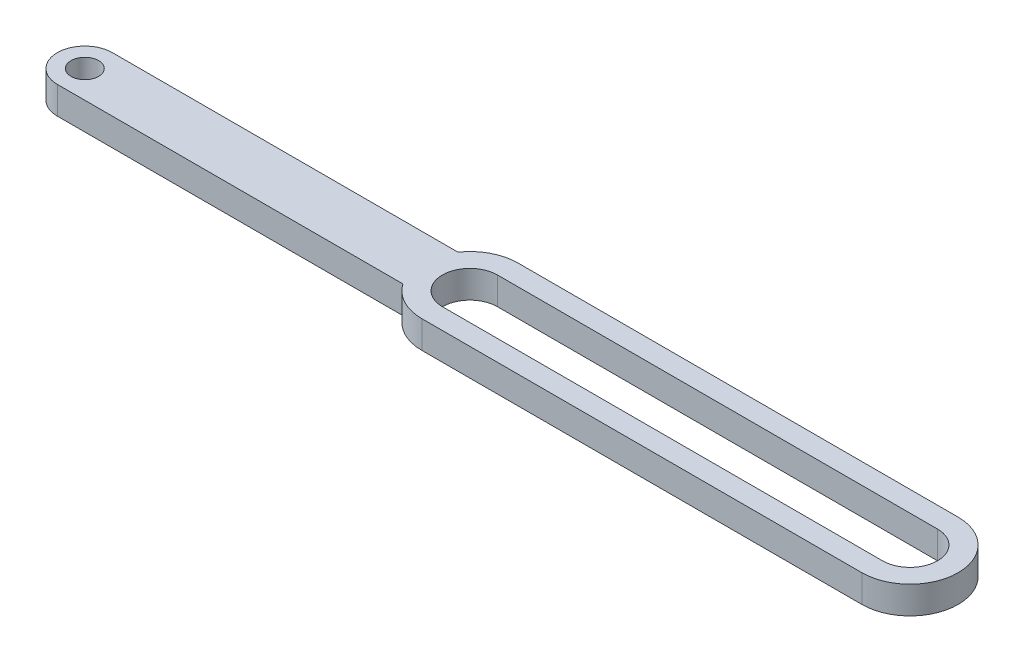
ISO-10303-21;
HEADER;
FILE_DESCRIPTION(('STEP AP214'),'2;1');
FILE_NAME('part.step','',(''),(''),'','','');
FILE_SCHEMA(('AUTOMOTIVE_DESIGN { 1 0 10303 214 1 1 1 1 }'));
ENDSEC;
DATA;
#1=APPLICATION_CONTEXT('core data for automotive mechanical design processes');
#2=APPLICATION_PROTOCOL_DEFINITION('international standard','automotive_design',2000,#1);
#3=PRODUCT_CONTEXT('',#1,'mechanical');
#4=PRODUCT('Part','Part','',(#3));
#5=PRODUCT_RELATED_PRODUCT_CATEGORY('part','',(#4));
#6=PRODUCT_DEFINITION_FORMATION('','',#4);
#7=PRODUCT_DEFINITION_CONTEXT('part definition',#1,'design');
#8=PRODUCT_DEFINITION('design','',#6,#7);
#9=PRODUCT_DEFINITION_SHAPE('','',#8);
#10=(LENGTH_UNIT() NAMED_UNIT(*) SI_UNIT(.MILLI.,.METRE.));
#11=(NAMED_UNIT(*) PLANE_ANGLE_UNIT() SI_UNIT($,.RADIAN.));
#12=(NAMED_UNIT(*) SI_UNIT($,.STERADIAN.) SOLID_ANGLE_UNIT());
#13=UNCERTAINTY_MEASURE_WITH_UNIT(LENGTH_MEASURE(1.E-05),#10,'distance_accuracy_value','');
#14=(GEOMETRIC_REPRESENTATION_CONTEXT(3) GLOBAL_UNCERTAINTY_ASSIGNED_CONTEXT((#13)) GLOBAL_UNIT_ASSIGNED_CONTEXT((#10,
#11,#12)) REPRESENTATION_CONTEXT('',''));
#15=CARTESIAN_POINT('',(0.,0.,0.));
#16=DIRECTION('',(0.,0.,1.));
#17=DIRECTION('',(1.,0.,0.));
#18=AXIS2_PLACEMENT_3D('',#15,#16,#17);
#19=CARTESIAN_POINT('',(-30.,2.,0.));
#20=DIRECTION('',(0.,1.,0.));
#21=DIRECTION('',(0.,0.,1.));
#22=AXIS2_PLACEMENT_3D('',#19,#20,#21);
#23=PLANE('',#22);
#24=CARTESIAN_POINT('',(-30.,2.,0.));
#25=DIRECTION('',(0.,1.,0.));
#26=DIRECTION('',(0.,0.,1.));
#27=AXIS2_PLACEMENT_3D('',#24,#25,#26);
#28=CIRCLE('',#27,2.);
#29=CARTESIAN_POINT('',(-30.,2.,-2.));
#30=VERTEX_POINT('',#29);
#31=CARTESIAN_POINT('',(-30.,2.,2.));
#32=VERTEX_POINT('',#31);
#33=EDGE_CURVE('E170',#30,#32,#28,.T.);
#34=ORIENTED_EDGE('',*,*,#33,.T.);
#35=DIRECTION('',(1.,0.,0.));
#36=VECTOR('',#35,1.);
#37=CARTESIAN_POINT('',(-30.,2.,2.));
#38=LINE('',#37,#36);
#39=CARTESIAN_POINT('',(-4.87228132326901,2.,2.));
#40=VERTEX_POINT('',#39);
#41=EDGE_CURVE('E173',#32,#40,#38,.T.);
#42=ORIENTED_EDGE('',*,*,#41,.T.);
#43=CARTESIAN_POINT('',(-2.,2.,0.));
#44=DIRECTION('',(0.,1.,0.));
#45=DIRECTION('',(0.,0.,1.));
#46=AXIS2_PLACEMENT_3D('',#43,#44,#45);
#47=CIRCLE('',#46,3.5);
#48=CARTESIAN_POINT('',(-2.,2.,3.5));
#49=VERTEX_POINT('',#48);
#50=EDGE_CURVE('E176',#40,#49,#47,.T.);
#51=ORIENTED_EDGE('',*,*,#50,.T.);
#52=DIRECTION('',(1.,0.,0.));
#53=VECTOR('',#52,1.);
#54=CARTESIAN_POINT('',(-2.,2.,3.5));
#55=LINE('',#54,#53);
#56=CARTESIAN_POINT('',(30.,2.,3.49999999999999));
#57=VERTEX_POINT('',#56);
#58=EDGE_CURVE('E178',#49,#57,#55,.T.);
#59=ORIENTED_EDGE('',*,*,#58,.T.);
#60=CARTESIAN_POINT('',(30.,2.,0.));
#61=DIRECTION('',(0.,1.,0.));
#62=DIRECTION('',(0.,0.,1.));
#63=AXIS2_PLACEMENT_3D('',#60,#61,#62);
#64=CIRCLE('',#63,3.5);
#65=CARTESIAN_POINT('',(30.,2.,-3.5));
#66=VERTEX_POINT('',#65);
#67=EDGE_CURVE('E180',#57,#66,#64,.T.);
#68=ORIENTED_EDGE('',*,*,#67,.T.);
#69=DIRECTION('',(-1.,0.,0.));
#70=VECTOR('',#69,1.);
#71=CARTESIAN_POINT('',(-2.,2.,-3.5));
#72=LINE('',#71,#70);
#73=CARTESIAN_POINT('',(-2.,2.,-3.5));
#74=VERTEX_POINT('',#73);
#75=EDGE_CURVE('E182',#66,#74,#72,.T.);
#76=ORIENTED_EDGE('',*,*,#75,.T.);
#77=CARTESIAN_POINT('',(-2.,2.,0.));
#78=DIRECTION('',(0.,1.,0.));
#79=DIRECTION('',(0.,0.,1.));
#80=AXIS2_PLACEMENT_3D('',#77,#78,#79);
#81=CIRCLE('',#80,3.5);
#82=CARTESIAN_POINT('',(-4.87228132326901,2.,-2.));
#83=VERTEX_POINT('',#82);
#84=EDGE_CURVE('E184',#74,#83,#81,.T.);
#85=ORIENTED_EDGE('',*,*,#84,.T.);
#86=DIRECTION('',(-1.,0.,0.));
#87=VECTOR('',#86,1.);
#88=CARTESIAN_POINT('',(-30.,2.,-2.));
#89=LINE('',#88,#87);
#90=EDGE_CURVE('E186',#83,#30,#89,.T.);
#91=ORIENTED_EDGE('',*,*,#90,.T.);
#92=EDGE_LOOP('',(#34,#42,#51,#59,#68,#76,#85,#91));
#93=FACE_BOUND('',#92,.T.);
#94=CARTESIAN_POINT('',(-30.,2.,0.));
#95=DIRECTION('',(0.,1.,0.));
#96=DIRECTION('',(0.,0.,1.));
#97=AXIS2_PLACEMENT_3D('',#94,#95,#96);
#98=CIRCLE('',#97,0.999999999999998);
#99=CARTESIAN_POINT('',(-30.,2.,0.999999999999998));
#100=VERTEX_POINT('',#99);
#101=EDGE_CURVE('E164',#100,#100,#98,.T.);
#102=ORIENTED_EDGE('',*,*,#101,.F.);
#103=EDGE_LOOP('',(#102));
#104=FACE_BOUND('',#103,.T.);
#105=DIRECTION('',(-1.,0.,0.));
#106=VECTOR('',#105,1.);
#107=CARTESIAN_POINT('',(-2.,2.,-2.));
#108=LINE('',#107,#106);
#109=CARTESIAN_POINT('',(30.,2.,-2.));
#110=VERTEX_POINT('',#109);
#111=CARTESIAN_POINT('',(-2.,2.,-2.));
#112=VERTEX_POINT('',#111);
#113=EDGE_CURVE('E136',#110,#112,#108,.T.);
#114=ORIENTED_EDGE('',*,*,#113,.F.);
#115=CARTESIAN_POINT('',(30.,2.,0.));
#116=DIRECTION('',(0.,1.,0.));
#117=DIRECTION('',(0.,0.,1.));
#118=AXIS2_PLACEMENT_3D('',#115,#116,#117);
#119=CIRCLE('',#118,2.);
#120=CARTESIAN_POINT('',(30.,2.,2.));
#121=VERTEX_POINT('',#120);
#122=EDGE_CURVE('E128',#121,#110,#119,.T.);
#123=ORIENTED_EDGE('',*,*,#122,.F.);
#124=DIRECTION('',(1.,0.,0.));
#125=VECTOR('',#124,1.);
#126=CARTESIAN_POINT('',(-2.,2.,2.));
#127=LINE('',#126,#125);
#128=CARTESIAN_POINT('',(-2.,2.,2.));
#129=VERTEX_POINT('',#128);
#130=EDGE_CURVE('E150',#129,#121,#127,.T.);
#131=ORIENTED_EDGE('',*,*,#130,.F.);
#132=CARTESIAN_POINT('',(-2.,2.,0.));
#133=DIRECTION('',(0.,1.,0.));
#134=DIRECTION('',(0.,0.,1.));
#135=AXIS2_PLACEMENT_3D('',#132,#133,#134);
#136=CIRCLE('',#135,2.);
#137=EDGE_CURVE('E148',#112,#129,#136,.T.);
#138=ORIENTED_EDGE('',*,*,#137,.F.);
#139=EDGE_LOOP('',(#114,#123,#131,#138));
#140=FACE_BOUND('',#139,.T.);
#141=ADVANCED_FACE('F39',(#93,#104,#140),#23,.T.);
#142=CARTESIAN_POINT('',(-30.,0.,0.));
#143=DIRECTION('',(0.,1.,0.));
#144=DIRECTION('',(0.,0.,1.));
#145=AXIS2_PLACEMENT_3D('',#142,#143,#144);
#146=PLANE('',#145);
#147=CARTESIAN_POINT('',(-30.,0.,0.));
#148=DIRECTION('',(0.,1.,0.));
#149=DIRECTION('',(0.,0.,1.));
#150=AXIS2_PLACEMENT_3D('',#147,#148,#149);
#151=CIRCLE('',#150,0.999999999999998);
#152=CARTESIAN_POINT('',(-30.,0.,0.999999999999998));
#153=VERTEX_POINT('',#152);
#154=EDGE_CURVE('E144',#153,#153,#151,.T.);
#155=ORIENTED_EDGE('',*,*,#154,.T.);
#156=EDGE_LOOP('',(#155));
#157=FACE_BOUND('',#156,.T.);
#158=CARTESIAN_POINT('',(-30.,0.,0.));
#159=DIRECTION('',(0.,1.,0.));
#160=DIRECTION('',(0.,0.,1.));
#161=AXIS2_PLACEMENT_3D('',#158,#159,#160);
#162=CIRCLE('',#161,2.);
#163=CARTESIAN_POINT('',(-30.,0.,-2.));
#164=VERTEX_POINT('',#163);
#165=CARTESIAN_POINT('',(-30.,0.,2.));
#166=VERTEX_POINT('',#165);
#167=EDGE_CURVE('E167',#164,#166,#162,.T.);
#168=ORIENTED_EDGE('',*,*,#167,.F.);
#169=DIRECTION('',(-1.,0.,0.));
#170=VECTOR('',#169,1.);
#171=CARTESIAN_POINT('',(-30.,0.,-2.));
#172=LINE('',#171,#170);
#173=CARTESIAN_POINT('',(-4.87228132326901,0.,-2.));
#174=VERTEX_POINT('',#173);
#175=EDGE_CURVE('E174',#174,#164,#172,.T.);
#176=ORIENTED_EDGE('',*,*,#175,.F.);
#177=CARTESIAN_POINT('',(-2.,0.,0.));
#178=DIRECTION('',(0.,1.,0.));
#179=DIRECTION('',(0.,0.,1.));
#180=AXIS2_PLACEMENT_3D('',#177,#178,#179);
#181=CIRCLE('',#180,3.5);
#182=CARTESIAN_POINT('',(-2.,0.,-3.5));
#183=VERTEX_POINT('',#182);
#184=EDGE_CURVE('E201',#183,#174,#181,.T.);
#185=ORIENTED_EDGE('',*,*,#184,.F.);
#186=DIRECTION('',(-1.,0.,0.));
#187=VECTOR('',#186,1.);
#188=CARTESIAN_POINT('',(-2.,0.,-3.5));
#189=LINE('',#188,#187);
#190=CARTESIAN_POINT('',(30.,0.,-3.5));
#191=VERTEX_POINT('',#190);
#192=EDGE_CURVE('E199',#191,#183,#189,.T.);
#193=ORIENTED_EDGE('',*,*,#192,.F.);
#194=CARTESIAN_POINT('',(30.,0.,0.));
#195=DIRECTION('',(0.,1.,0.));
#196=DIRECTION('',(0.,0.,1.));
#197=AXIS2_PLACEMENT_3D('',#194,#195,#196);
#198=CIRCLE('',#197,3.5);
#199=CARTESIAN_POINT('',(30.,0.,3.49999999999999));
#200=VERTEX_POINT('',#199);
#201=EDGE_CURVE('E197',#200,#191,#198,.T.);
#202=ORIENTED_EDGE('',*,*,#201,.F.);
#203=DIRECTION('',(1.,0.,0.));
#204=VECTOR('',#203,1.);
#205=CARTESIAN_POINT('',(-2.,0.,3.5));
#206=LINE('',#205,#204);
#207=CARTESIAN_POINT('',(-2.,0.,3.5));
#208=VERTEX_POINT('',#207);
#209=EDGE_CURVE('E195',#208,#200,#206,.T.);
#210=ORIENTED_EDGE('',*,*,#209,.F.);
#211=CARTESIAN_POINT('',(-2.,0.,0.));
#212=DIRECTION('',(0.,1.,0.));
#213=DIRECTION('',(0.,0.,1.));
#214=AXIS2_PLACEMENT_3D('',#211,#212,#213);
#215=CIRCLE('',#214,3.5);
#216=CARTESIAN_POINT('',(-4.87228132326901,0.,2.));
#217=VERTEX_POINT('',#216);
#218=EDGE_CURVE('E193',#217,#208,#215,.T.);
#219=ORIENTED_EDGE('',*,*,#218,.F.);
#220=DIRECTION('',(1.,0.,0.));
#221=VECTOR('',#220,1.);
#222=CARTESIAN_POINT('',(-30.,0.,2.));
#223=LINE('',#222,#221);
#224=EDGE_CURVE('E191',#166,#217,#223,.T.);
#225=ORIENTED_EDGE('',*,*,#224,.F.);
#226=EDGE_LOOP('',(#168,#176,#185,#193,#202,#210,#219,#225));
#227=FACE_BOUND('',#226,.T.);
#228=CARTESIAN_POINT('',(30.,0.,0.));
#229=DIRECTION('',(0.,1.,0.));
#230=DIRECTION('',(0.,0.,1.));
#231=AXIS2_PLACEMENT_3D('',#228,#229,#230);
#232=CIRCLE('',#231,2.);
#233=CARTESIAN_POINT('',(30.,0.,2.));
#234=VERTEX_POINT('',#233);
#235=CARTESIAN_POINT('',(30.,0.,-2.));
#236=VERTEX_POINT('',#235);
#237=EDGE_CURVE('E62',#234,#236,#232,.T.);
#238=ORIENTED_EDGE('',*,*,#237,.T.);
#239=DIRECTION('',(-1.,0.,0.));
#240=VECTOR('',#239,1.);
#241=CARTESIAN_POINT('',(-2.,0.,-2.));
#242=LINE('',#241,#240);
#243=CARTESIAN_POINT('',(-2.,0.,-2.));
#244=VERTEX_POINT('',#243);
#245=EDGE_CURVE('E143',#236,#244,#242,.T.);
#246=ORIENTED_EDGE('',*,*,#245,.T.);
#247=CARTESIAN_POINT('',(-2.,0.,0.));
#248=DIRECTION('',(0.,1.,0.));
#249=DIRECTION('',(0.,0.,1.));
#250=AXIS2_PLACEMENT_3D('',#247,#248,#249);
#251=CIRCLE('',#250,2.);
#252=CARTESIAN_POINT('',(-2.,0.,2.));
#253=VERTEX_POINT('',#252);
#254=EDGE_CURVE('E156',#244,#253,#251,.T.);
#255=ORIENTED_EDGE('',*,*,#254,.T.);
#256=DIRECTION('',(1.,0.,0.));
#257=VECTOR('',#256,1.);
#258=CARTESIAN_POINT('',(-2.,0.,2.));
#259=LINE('',#258,#257);
#260=EDGE_CURVE('E137',#253,#234,#259,.T.);
#261=ORIENTED_EDGE('',*,*,#260,.T.);
#262=EDGE_LOOP('',(#238,#246,#255,#261));
#263=FACE_BOUND('',#262,.T.);
#264=ADVANCED_FACE('F231',(#157,#227,#263),#146,.F.);
#265=CARTESIAN_POINT('',(-30.,2.,0.));
#266=DIRECTION('',(0.,-1.,0.));
#267=DIRECTION('',(0.,0.,-1.));
#268=AXIS2_PLACEMENT_3D('',#265,#266,#267);
#269=CYLINDRICAL_SURFACE('',#268,2.);
#270=ORIENTED_EDGE('',*,*,#167,.T.);
#271=DIRECTION('',(0.,-1.,0.));
#272=VECTOR('',#271,1.);
#273=CARTESIAN_POINT('',(-30.,2.,2.));
#274=LINE('',#273,#272);
#275=EDGE_CURVE('E11',#32,#166,#274,.T.);
#276=ORIENTED_EDGE('',*,*,#275,.F.);
#277=ORIENTED_EDGE('',*,*,#33,.F.);
#278=DIRECTION('',(0.,-1.,0.));
#279=VECTOR('',#278,1.);
#280=CARTESIAN_POINT('',(-30.,2.,-2.));
#281=LINE('',#280,#279);
#282=EDGE_CURVE('E188',#30,#164,#281,.T.);
#283=ORIENTED_EDGE('',*,*,#282,.T.);
#284=EDGE_LOOP('',(#270,#276,#277,#283));
#285=FACE_BOUND('',#284,.T.);
#286=ADVANCED_FACE('F41',(#285),#269,.T.);
#287=CARTESIAN_POINT('',(-30.,2.,2.));
#288=DIRECTION('',(0.,0.,-1.));
#289=DIRECTION('',(-1.,0.,0.));
#290=AXIS2_PLACEMENT_3D('',#287,#288,#289);
#291=PLANE('',#290);
#292=ORIENTED_EDGE('',*,*,#224,.T.);
#293=DIRECTION('',(0.,-1.,0.));
#294=VECTOR('',#293,1.);
#295=CARTESIAN_POINT('',(-4.87228132326901,2.,2.));
#296=LINE('',#295,#294);
#297=EDGE_CURVE('E47',#40,#217,#296,.T.);
#298=ORIENTED_EDGE('',*,*,#297,.F.);
#299=ORIENTED_EDGE('',*,*,#41,.F.);
#300=ORIENTED_EDGE('',*,*,#275,.T.);
#301=EDGE_LOOP('',(#292,#298,#299,#300));
#302=FACE_BOUND('',#301,.T.);
#303=ADVANCED_FACE('F249',(#302),#291,.F.);
#304=CARTESIAN_POINT('',(-2.,2.,0.));
#305=DIRECTION('',(0.,-1.,0.));
#306=DIRECTION('',(0.,0.,-1.));
#307=AXIS2_PLACEMENT_3D('',#304,#305,#306);
#308=CYLINDRICAL_SURFACE('',#307,3.5);
#309=ORIENTED_EDGE('',*,*,#218,.T.);
#310=DIRECTION('',(0.,-1.,0.));
#311=VECTOR('',#310,1.);
#312=CARTESIAN_POINT('',(-2.,2.,3.5));
#313=LINE('',#312,#311);
#314=EDGE_CURVE('E218',#49,#208,#313,.T.);
#315=ORIENTED_EDGE('',*,*,#314,.F.);
#316=ORIENTED_EDGE('',*,*,#50,.F.);
#317=ORIENTED_EDGE('',*,*,#297,.T.);
#318=EDGE_LOOP('',(#309,#315,#316,#317));
#319=FACE_BOUND('',#318,.T.);
#320=ADVANCED_FACE('F225',(#319),#308,.T.);
#321=CARTESIAN_POINT('',(-2.,2.,3.5));
#322=DIRECTION('',(0.,0.,-1.));
#323=DIRECTION('',(-1.,0.,0.));
#324=AXIS2_PLACEMENT_3D('',#321,#322,#323);
#325=PLANE('',#324);
#326=ORIENTED_EDGE('',*,*,#209,.T.);
#327=DIRECTION('',(0.,-1.,0.));
#328=VECTOR('',#327,1.);
#329=CARTESIAN_POINT('',(30.,2.,3.49999999999999));
#330=LINE('',#329,#328);
#331=EDGE_CURVE('E215',#57,#200,#330,.T.);
#332=ORIENTED_EDGE('',*,*,#331,.F.);
#333=ORIENTED_EDGE('',*,*,#58,.F.);
#334=ORIENTED_EDGE('',*,*,#314,.T.);
#335=EDGE_LOOP('',(#326,#332,#333,#334));
#336=FACE_BOUND('',#335,.T.);
#337=ADVANCED_FACE('F237',(#336),#325,.F.);
#338=CARTESIAN_POINT('',(30.,2.,0.));
#339=DIRECTION('',(0.,-1.,0.));
#340=DIRECTION('',(0.,0.,-1.));
#341=AXIS2_PLACEMENT_3D('',#338,#339,#340);
#342=CYLINDRICAL_SURFACE('',#341,3.5);
#343=ORIENTED_EDGE('',*,*,#201,.T.);
#344=DIRECTION('',(0.,-1.,0.));
#345=VECTOR('',#344,1.);
#346=CARTESIAN_POINT('',(30.,2.,-3.5));
#347=LINE('',#346,#345);
#348=EDGE_CURVE('E212',#66,#191,#347,.T.);
#349=ORIENTED_EDGE('',*,*,#348,.F.);
#350=ORIENTED_EDGE('',*,*,#67,.F.);
#351=ORIENTED_EDGE('',*,*,#331,.T.);
#352=EDGE_LOOP('',(#343,#349,#350,#351));
#353=FACE_BOUND('',#352,.T.);
#354=ADVANCED_FACE('F241',(#353),#342,.T.);
#355=CARTESIAN_POINT('',(-2.,2.,-3.5));
#356=DIRECTION('',(0.,0.,1.));
#357=DIRECTION('',(1.,0.,0.));
#358=AXIS2_PLACEMENT_3D('',#355,#356,#357);
#359=PLANE('',#358);
#360=ORIENTED_EDGE('',*,*,#192,.T.);
#361=DIRECTION('',(0.,-1.,0.));
#362=VECTOR('',#361,1.);
#363=CARTESIAN_POINT('',(-2.,2.,-3.5));
#364=LINE('',#363,#362);
#365=EDGE_CURVE('E209',#74,#183,#364,.T.);
#366=ORIENTED_EDGE('',*,*,#365,.F.);
#367=ORIENTED_EDGE('',*,*,#75,.F.);
#368=ORIENTED_EDGE('',*,*,#348,.T.);
#369=EDGE_LOOP('',(#360,#366,#367,#368));
#370=FACE_BOUND('',#369,.T.);
#371=ADVANCED_FACE('F262',(#370),#359,.F.);
#372=CARTESIAN_POINT('',(-2.,2.,0.));
#373=DIRECTION('',(0.,-1.,0.));
#374=DIRECTION('',(0.,0.,-1.));
#375=AXIS2_PLACEMENT_3D('',#372,#373,#374);
#376=CYLINDRICAL_SURFACE('',#375,3.5);
#377=ORIENTED_EDGE('',*,*,#184,.T.);
#378=DIRECTION('',(0.,-1.,0.));
#379=VECTOR('',#378,1.);
#380=CARTESIAN_POINT('',(-4.87228132326901,2.,-2.));
#381=LINE('',#380,#379);
#382=EDGE_CURVE('E206',#83,#174,#381,.T.);
#383=ORIENTED_EDGE('',*,*,#382,.F.);
#384=ORIENTED_EDGE('',*,*,#84,.F.);
#385=ORIENTED_EDGE('',*,*,#365,.T.);
#386=EDGE_LOOP('',(#377,#383,#384,#385));
#387=FACE_BOUND('',#386,.T.);
#388=ADVANCED_FACE('F260',(#387),#376,.T.);
#389=CARTESIAN_POINT('',(-30.,2.,-2.));
#390=DIRECTION('',(0.,0.,1.));
#391=DIRECTION('',(1.,0.,0.));
#392=AXIS2_PLACEMENT_3D('',#389,#390,#391);
#393=PLANE('',#392);
#394=ORIENTED_EDGE('',*,*,#175,.T.);
#395=ORIENTED_EDGE('',*,*,#282,.F.);
#396=ORIENTED_EDGE('',*,*,#90,.F.);
#397=ORIENTED_EDGE('',*,*,#382,.T.);
#398=EDGE_LOOP('',(#394,#395,#396,#397));
#399=FACE_BOUND('',#398,.T.);
#400=ADVANCED_FACE('F255',(#399),#393,.F.);
#401=CARTESIAN_POINT('',(-30.,2.,0.));
#402=DIRECTION('',(0.,-1.,0.));
#403=DIRECTION('',(0.,0.,-1.));
#404=AXIS2_PLACEMENT_3D('',#401,#402,#403);
#405=CYLINDRICAL_SURFACE('',#404,0.999999999999998);
#406=ORIENTED_EDGE('',*,*,#101,.T.);
#407=EDGE_LOOP('',(#406));
#408=FACE_BOUND('',#407,.T.);
#409=ORIENTED_EDGE('',*,*,#154,.F.);
#410=EDGE_LOOP('',(#409));
#411=FACE_BOUND('',#410,.T.);
#412=ADVANCED_FACE('F279',(#408,#411),#405,.F.);
#413=CARTESIAN_POINT('',(30.,2.,0.));
#414=DIRECTION('',(0.,-1.,0.));
#415=DIRECTION('',(0.,0.,-1.));
#416=AXIS2_PLACEMENT_3D('',#413,#414,#415);
#417=CYLINDRICAL_SURFACE('',#416,2.);
#418=ORIENTED_EDGE('',*,*,#237,.F.);
#419=DIRECTION('',(0.,-1.,0.));
#420=VECTOR('',#419,1.);
#421=CARTESIAN_POINT('',(30.,2.,2.));
#422=LINE('',#421,#420);
#423=EDGE_CURVE('E132',#121,#234,#422,.T.);
#424=ORIENTED_EDGE('',*,*,#423,.F.);
#425=ORIENTED_EDGE('',*,*,#122,.T.);
#426=DIRECTION('',(0.,-1.,0.));
#427=VECTOR('',#426,1.);
#428=CARTESIAN_POINT('',(30.,2.,-2.));
#429=LINE('',#428,#427);
#430=EDGE_CURVE('E131',#110,#236,#429,.T.);
#431=ORIENTED_EDGE('',*,*,#430,.T.);
#432=EDGE_LOOP('',(#418,#424,#425,#431));
#433=FACE_BOUND('',#432,.T.);
#434=ADVANCED_FACE('F130',(#433),#417,.F.);
#435=CARTESIAN_POINT('',(-2.,2.,-2.));
#436=DIRECTION('',(0.,0.,1.));
#437=DIRECTION('',(1.,0.,0.));
#438=AXIS2_PLACEMENT_3D('',#435,#436,#437);
#439=PLANE('',#438);
#440=ORIENTED_EDGE('',*,*,#245,.F.);
#441=ORIENTED_EDGE('',*,*,#430,.F.);
#442=ORIENTED_EDGE('',*,*,#113,.T.);
#443=DIRECTION('',(0.,-1.,0.));
#444=VECTOR('',#443,1.);
#445=CARTESIAN_POINT('',(-2.,2.,-2.));
#446=LINE('',#445,#444);
#447=EDGE_CURVE('E145',#112,#244,#446,.T.);
#448=ORIENTED_EDGE('',*,*,#447,.T.);
#449=EDGE_LOOP('',(#440,#441,#442,#448));
#450=FACE_BOUND('',#449,.T.);
#451=ADVANCED_FACE('F140',(#450),#439,.T.);
#452=CARTESIAN_POINT('',(-2.,2.,0.));
#453=DIRECTION('',(0.,-1.,0.));
#454=DIRECTION('',(0.,0.,-1.));
#455=AXIS2_PLACEMENT_3D('',#452,#453,#454);
#456=CYLINDRICAL_SURFACE('',#455,2.);
#457=ORIENTED_EDGE('',*,*,#254,.F.);
#458=ORIENTED_EDGE('',*,*,#447,.F.);
#459=ORIENTED_EDGE('',*,*,#137,.T.);
#460=DIRECTION('',(0.,-1.,0.));
#461=VECTOR('',#460,1.);
#462=CARTESIAN_POINT('',(-2.,2.,2.));
#463=LINE('',#462,#461);
#464=EDGE_CURVE('E54',#129,#253,#463,.T.);
#465=ORIENTED_EDGE('',*,*,#464,.T.);
#466=EDGE_LOOP('',(#457,#458,#459,#465));
#467=FACE_BOUND('',#466,.T.);
#468=ADVANCED_FACE('F296',(#467),#456,.F.);
#469=CARTESIAN_POINT('',(-2.,2.,2.));
#470=DIRECTION('',(0.,0.,-1.));
#471=DIRECTION('',(-1.,0.,0.));
#472=AXIS2_PLACEMENT_3D('',#469,#470,#471);
#473=PLANE('',#472);
#474=ORIENTED_EDGE('',*,*,#260,.F.);
#475=ORIENTED_EDGE('',*,*,#464,.F.);
#476=ORIENTED_EDGE('',*,*,#130,.T.);
#477=ORIENTED_EDGE('',*,*,#423,.T.);
#478=EDGE_LOOP('',(#474,#475,#476,#477));
#479=FACE_BOUND('',#478,.T.);
#480=ADVANCED_FACE('F301',(#479),#473,.T.);
#481=CLOSED_SHELL('',(#141,#264,#286,#303,#320,#337,#354,#371,#388,#400,#412,#434,#451,#468,#480));
#482=MANIFOLD_SOLID_BREP('B2',#481);
#483=ADVANCED_BREP_SHAPE_REPRESENTATION('',(#18,#482),#14);
#484=SHAPE_DEFINITION_REPRESENTATION(#9,#483);
ENDSEC;
END-ISO-10303-21;
